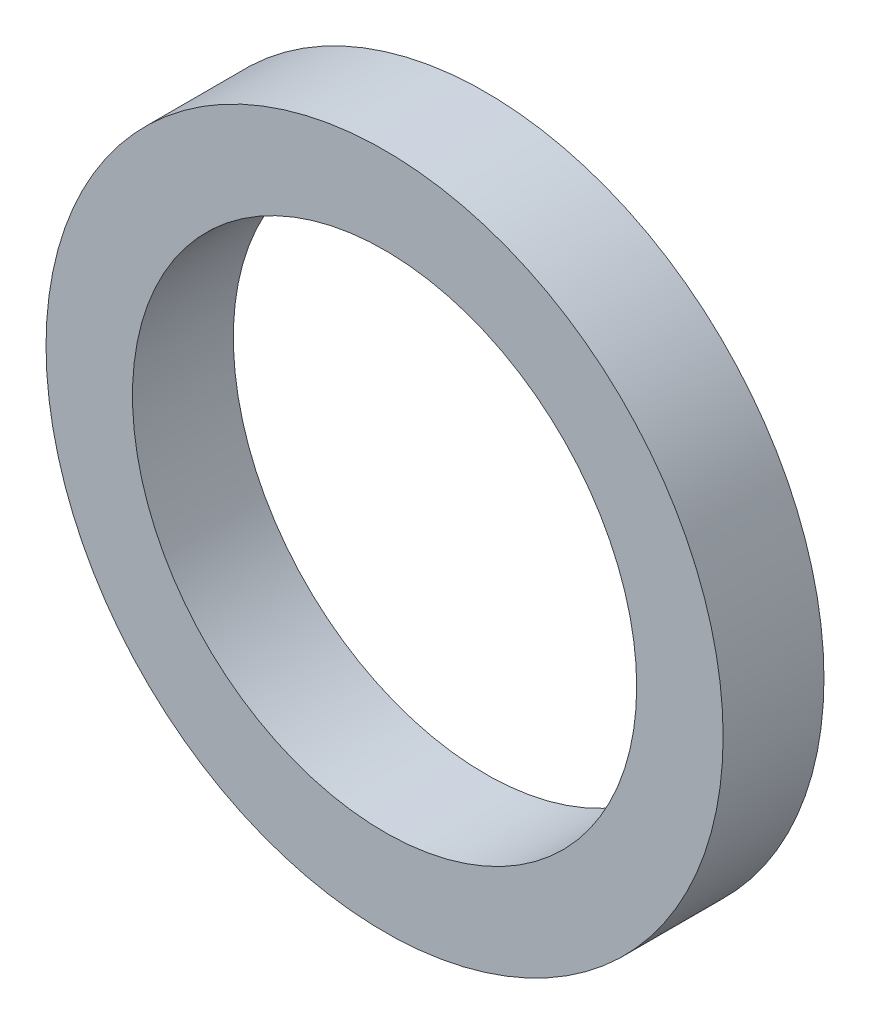
ISO-10303-21;
HEADER;
FILE_DESCRIPTION(('STEP AP214'),'2;1');
FILE_NAME('part.step','',(''),(''),'','','');
FILE_SCHEMA(('AUTOMOTIVE_DESIGN { 1 0 10303 214 1 1 1 1 }'));
ENDSEC;
DATA;
#1=APPLICATION_CONTEXT('core data for automotive mechanical design processes');
#2=APPLICATION_PROTOCOL_DEFINITION('international standard','automotive_design',2000,#1);
#3=PRODUCT_CONTEXT('',#1,'mechanical');
#4=PRODUCT('Part','Part','',(#3));
#5=PRODUCT_RELATED_PRODUCT_CATEGORY('part','',(#4));
#6=PRODUCT_DEFINITION_FORMATION('','',#4);
#7=PRODUCT_DEFINITION_CONTEXT('part definition',#1,'design');
#8=PRODUCT_DEFINITION('design','',#6,#7);
#9=PRODUCT_DEFINITION_SHAPE('','',#8);
#10=(LENGTH_UNIT() NAMED_UNIT(*) SI_UNIT(.MILLI.,.METRE.));
#11=(NAMED_UNIT(*) PLANE_ANGLE_UNIT() SI_UNIT($,.RADIAN.));
#12=(NAMED_UNIT(*) SI_UNIT($,.STERADIAN.) SOLID_ANGLE_UNIT());
#13=UNCERTAINTY_MEASURE_WITH_UNIT(LENGTH_MEASURE(1.E-05),#10,'distance_accuracy_value','');
#14=(GEOMETRIC_REPRESENTATION_CONTEXT(3) GLOBAL_UNCERTAINTY_ASSIGNED_CONTEXT((#13)) GLOBAL_UNIT_ASSIGNED_CONTEXT((#10,
#11,#12)) REPRESENTATION_CONTEXT('',''));
#15=CARTESIAN_POINT('',(0.,0.,0.));
#16=DIRECTION('',(0.,0.,1.));
#17=DIRECTION('',(1.,0.,0.));
#18=AXIS2_PLACEMENT_3D('',#15,#16,#17);
#19=CARTESIAN_POINT('',(0.,0.,7.));
#20=DIRECTION('',(0.,0.,1.));
#21=DIRECTION('',(1.,0.,0.));
#22=AXIS2_PLACEMENT_3D('',#19,#20,#21);
#23=PLANE('',#22);
#24=CARTESIAN_POINT('',(0.,0.,7.));
#25=DIRECTION('',(0.,0.,1.));
#26=DIRECTION('',(1.,0.,0.));
#27=AXIS2_PLACEMENT_3D('',#24,#25,#26);
#28=CIRCLE('',#27,23.5);
#29=CARTESIAN_POINT('',(23.5,0.,7.));
#30=VERTEX_POINT('',#29);
#31=EDGE_CURVE('E10',#30,#30,#28,.T.);
#32=ORIENTED_EDGE('',*,*,#31,.T.);
#33=EDGE_LOOP('',(#32));
#34=FACE_BOUND('',#33,.T.);
#35=CARTESIAN_POINT('',(0.,0.,7.));
#36=DIRECTION('',(0.,0.,1.));
#37=DIRECTION('',(1.,0.,0.));
#38=AXIS2_PLACEMENT_3D('',#35,#36,#37);
#39=CIRCLE('',#38,17.5);
#40=CARTESIAN_POINT('',(17.5,0.,7.));
#41=VERTEX_POINT('',#40);
#42=EDGE_CURVE('E44',#41,#41,#39,.T.);
#43=ORIENTED_EDGE('',*,*,#42,.F.);
#44=EDGE_LOOP('',(#43));
#45=FACE_BOUND('',#44,.T.);
#46=ADVANCED_FACE('F33',(#34,#45),#23,.T.);
#47=CARTESIAN_POINT('',(0.,0.,0.));
#48=DIRECTION('',(0.,0.,1.));
#49=DIRECTION('',(1.,0.,0.));
#50=AXIS2_PLACEMENT_3D('',#47,#48,#49);
#51=PLANE('',#50);
#52=CARTESIAN_POINT('',(0.,0.,0.));
#53=DIRECTION('',(0.,0.,1.));
#54=DIRECTION('',(1.,0.,0.));
#55=AXIS2_PLACEMENT_3D('',#52,#53,#54);
#56=CIRCLE('',#55,23.5);
#57=CARTESIAN_POINT('',(23.5,0.,0.));
#58=VERTEX_POINT('',#57);
#59=EDGE_CURVE('E37',#58,#58,#56,.T.);
#60=ORIENTED_EDGE('',*,*,#59,.F.);
#61=EDGE_LOOP('',(#60));
#62=FACE_BOUND('',#61,.T.);
#63=CARTESIAN_POINT('',(0.,0.,0.));
#64=DIRECTION('',(0.,0.,1.));
#65=DIRECTION('',(1.,0.,0.));
#66=AXIS2_PLACEMENT_3D('',#63,#64,#65);
#67=CIRCLE('',#66,17.5);
#68=CARTESIAN_POINT('',(17.5,0.,0.));
#69=VERTEX_POINT('',#68);
#70=EDGE_CURVE('E46',#69,#69,#67,.T.);
#71=ORIENTED_EDGE('',*,*,#70,.T.);
#72=EDGE_LOOP('',(#71));
#73=FACE_BOUND('',#72,.T.);
#74=ADVANCED_FACE('F56',(#62,#73),#51,.F.);
#75=CARTESIAN_POINT('',(0.,0.,7.));
#76=DIRECTION('',(0.,0.,-1.));
#77=DIRECTION('',(-1.,0.,0.));
#78=AXIS2_PLACEMENT_3D('',#75,#76,#77);
#79=CYLINDRICAL_SURFACE('',#78,23.5);
#80=ORIENTED_EDGE('',*,*,#31,.F.);
#81=EDGE_LOOP('',(#80));
#82=FACE_BOUND('',#81,.T.);
#83=ORIENTED_EDGE('',*,*,#59,.T.);
#84=EDGE_LOOP('',(#83));
#85=FACE_BOUND('',#84,.T.);
#86=ADVANCED_FACE('F35',(#82,#85),#79,.T.);
#87=CARTESIAN_POINT('',(0.,0.,7.));
#88=DIRECTION('',(0.,0.,-1.));
#89=DIRECTION('',(-1.,0.,0.));
#90=AXIS2_PLACEMENT_3D('',#87,#88,#89);
#91=CYLINDRICAL_SURFACE('',#90,17.5);
#92=ORIENTED_EDGE('',*,*,#42,.T.);
#93=EDGE_LOOP('',(#92));
#94=FACE_BOUND('',#93,.T.);
#95=ORIENTED_EDGE('',*,*,#70,.F.);
#96=EDGE_LOOP('',(#95));
#97=FACE_BOUND('',#96,.T.);
#98=ADVANCED_FACE('F52',(#94,#97),#91,.F.);
#99=CLOSED_SHELL('',(#46,#74,#86,#98));
#100=MANIFOLD_SOLID_BREP('B2',#99);
#101=ADVANCED_BREP_SHAPE_REPRESENTATION('',(#18,#100),#14);
#102=SHAPE_DEFINITION_REPRESENTATION(#9,#101);
ENDSEC;
END-ISO-10303-21;
